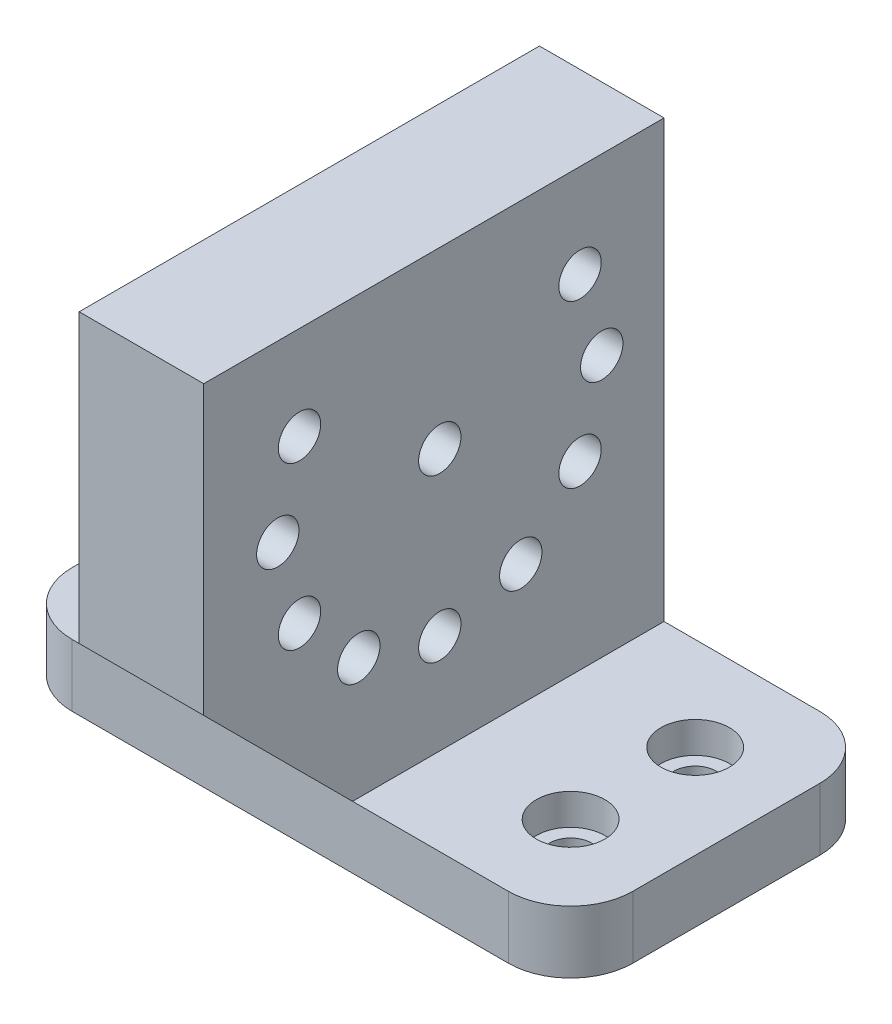
ISO-10303-21;
HEADER;
FILE_DESCRIPTION(('STEP AP214'),'2;1');
FILE_NAME('part.step','',(''),(''),'','','');
FILE_SCHEMA(('AUTOMOTIVE_DESIGN { 1 0 10303 214 1 1 1 1 }'));
ENDSEC;
DATA;
#1=APPLICATION_CONTEXT('core data for automotive mechanical design processes');
#2=APPLICATION_PROTOCOL_DEFINITION('international standard','automotive_design',2000,#1);
#3=PRODUCT_CONTEXT('',#1,'mechanical');
#4=PRODUCT('Part','Part','',(#3));
#5=PRODUCT_RELATED_PRODUCT_CATEGORY('part','',(#4));
#6=PRODUCT_DEFINITION_FORMATION('','',#4);
#7=PRODUCT_DEFINITION_CONTEXT('part definition',#1,'design');
#8=PRODUCT_DEFINITION('design','',#6,#7);
#9=PRODUCT_DEFINITION_SHAPE('','',#8);
#10=(LENGTH_UNIT() NAMED_UNIT(*) SI_UNIT(.MILLI.,.METRE.));
#11=(NAMED_UNIT(*) PLANE_ANGLE_UNIT() SI_UNIT($,.RADIAN.));
#12=(NAMED_UNIT(*) SI_UNIT($,.STERADIAN.) SOLID_ANGLE_UNIT());
#13=UNCERTAINTY_MEASURE_WITH_UNIT(LENGTH_MEASURE(1.E-05),#10,'distance_accuracy_value','');
#14=(GEOMETRIC_REPRESENTATION_CONTEXT(3) GLOBAL_UNCERTAINTY_ASSIGNED_CONTEXT((#13)) GLOBAL_UNIT_ASSIGNED_CONTEXT((#10,
#11,#12)) REPRESENTATION_CONTEXT('',''));
#15=CARTESIAN_POINT('',(0.,0.,0.));
#16=DIRECTION('',(0.,0.,1.));
#17=DIRECTION('',(1.,0.,0.));
#18=AXIS2_PLACEMENT_3D('',#15,#16,#17);
#19=CARTESIAN_POINT('',(-15.,5.,-5.));
#20=DIRECTION('',(0.,-1.,0.));
#21=DIRECTION('',(0.,0.,-1.));
#22=AXIS2_PLACEMENT_3D('',#19,#20,#21);
#23=CYLINDRICAL_SURFACE('',#22,1.7);
#24=CARTESIAN_POINT('',(-15.,0.,-5.));
#25=DIRECTION('',(0.,1.,0.));
#26=DIRECTION('',(0.,0.,1.));
#27=AXIS2_PLACEMENT_3D('',#24,#25,#26);
#28=CIRCLE('',#27,1.7);
#29=CARTESIAN_POINT('',(-15.,0.,-3.3));
#30=VERTEX_POINT('',#29);
#31=EDGE_CURVE('E175',#30,#30,#28,.T.);
#32=ORIENTED_EDGE('',*,*,#31,.F.);
#33=EDGE_LOOP('',(#32));
#34=FACE_BOUND('',#33,.T.);
#35=CARTESIAN_POINT('',(-15.,2.5,-5.));
#36=DIRECTION('',(0.,1.,0.));
#37=DIRECTION('',(0.,0.,1.));
#38=AXIS2_PLACEMENT_3D('',#35,#36,#37);
#39=CIRCLE('',#38,1.7);
#40=CARTESIAN_POINT('',(-15.,2.5,-3.3));
#41=VERTEX_POINT('',#40);
#42=EDGE_CURVE('E51',#41,#41,#39,.T.);
#43=ORIENTED_EDGE('',*,*,#42,.T.);
#44=EDGE_LOOP('',(#43));
#45=FACE_BOUND('',#44,.T.);
#46=ADVANCED_FACE('F47',(#34,#45),#23,.F.);
#47=CARTESIAN_POINT('',(15.,5.,-5.));
#48=DIRECTION('',(0.,-1.,0.));
#49=DIRECTION('',(0.,0.,-1.));
#50=AXIS2_PLACEMENT_3D('',#47,#48,#49);
#51=CYLINDRICAL_SURFACE('',#50,1.7);
#52=CARTESIAN_POINT('',(15.,0.,-5.));
#53=DIRECTION('',(0.,1.,0.));
#54=DIRECTION('',(0.,0.,-1.));
#55=AXIS2_PLACEMENT_3D('',#52,#53,#54);
#56=CIRCLE('',#55,1.7);
#57=CARTESIAN_POINT('',(15.,0.,-6.7));
#58=VERTEX_POINT('',#57);
#59=EDGE_CURVE('E320',#58,#58,#56,.T.);
#60=ORIENTED_EDGE('',*,*,#59,.F.);
#61=EDGE_LOOP('',(#60));
#62=FACE_BOUND('',#61,.T.);
#63=CARTESIAN_POINT('',(15.,2.5,-5.));
#64=DIRECTION('',(0.,1.,0.));
#65=DIRECTION('',(0.,0.,1.));
#66=AXIS2_PLACEMENT_3D('',#63,#64,#65);
#67=CIRCLE('',#66,1.7);
#68=CARTESIAN_POINT('',(15.,2.5,-3.3));
#69=VERTEX_POINT('',#68);
#70=EDGE_CURVE('E220',#69,#69,#67,.T.);
#71=ORIENTED_EDGE('',*,*,#70,.T.);
#72=EDGE_LOOP('',(#71));
#73=FACE_BOUND('',#72,.T.);
#74=ADVANCED_FACE('F447',(#62,#73),#51,.F.);
#75=CARTESIAN_POINT('',(15.,5.,5.));
#76=DIRECTION('',(0.,-1.,0.));
#77=DIRECTION('',(0.,0.,-1.));
#78=AXIS2_PLACEMENT_3D('',#75,#76,#77);
#79=CYLINDRICAL_SURFACE('',#78,1.7);
#80=CARTESIAN_POINT('',(15.,0.,5.));
#81=DIRECTION('',(0.,1.,0.));
#82=DIRECTION('',(0.,0.,1.));
#83=AXIS2_PLACEMENT_3D('',#80,#81,#82);
#84=CIRCLE('',#83,1.7);
#85=CARTESIAN_POINT('',(15.,0.,6.7));
#86=VERTEX_POINT('',#85);
#87=EDGE_CURVE('E316',#86,#86,#84,.T.);
#88=ORIENTED_EDGE('',*,*,#87,.F.);
#89=EDGE_LOOP('',(#88));
#90=FACE_BOUND('',#89,.T.);
#91=CARTESIAN_POINT('',(15.,2.5,5.));
#92=DIRECTION('',(0.,1.,0.));
#93=DIRECTION('',(0.,0.,1.));
#94=AXIS2_PLACEMENT_3D('',#91,#92,#93);
#95=CIRCLE('',#94,1.7);
#96=CARTESIAN_POINT('',(15.,2.5,6.7));
#97=VERTEX_POINT('',#96);
#98=EDGE_CURVE('E216',#97,#97,#95,.T.);
#99=ORIENTED_EDGE('',*,*,#98,.T.);
#100=EDGE_LOOP('',(#99));
#101=FACE_BOUND('',#100,.T.);
#102=ADVANCED_FACE('F453',(#90,#101),#79,.F.);
#103=CARTESIAN_POINT('',(-15.,5.,5.));
#104=DIRECTION('',(0.,-1.,0.));
#105=DIRECTION('',(0.,0.,-1.));
#106=AXIS2_PLACEMENT_3D('',#103,#104,#105);
#107=CYLINDRICAL_SURFACE('',#106,1.7);
#108=CARTESIAN_POINT('',(-15.,0.,5.));
#109=DIRECTION('',(0.,1.,0.));
#110=DIRECTION('',(0.,0.,-1.));
#111=AXIS2_PLACEMENT_3D('',#108,#109,#110);
#112=CIRCLE('',#111,1.7);
#113=CARTESIAN_POINT('',(-15.,0.,3.30000000000001));
#114=VERTEX_POINT('',#113);
#115=EDGE_CURVE('E312',#114,#114,#112,.T.);
#116=ORIENTED_EDGE('',*,*,#115,.F.);
#117=EDGE_LOOP('',(#116));
#118=FACE_BOUND('',#117,.T.);
#119=CARTESIAN_POINT('',(-15.,2.5,5.));
#120=DIRECTION('',(0.,1.,0.));
#121=DIRECTION('',(0.,0.,1.));
#122=AXIS2_PLACEMENT_3D('',#119,#120,#121);
#123=CIRCLE('',#122,1.7);
#124=CARTESIAN_POINT('',(-15.,2.5,6.7));
#125=VERTEX_POINT('',#124);
#126=EDGE_CURVE('E212',#125,#125,#123,.T.);
#127=ORIENTED_EDGE('',*,*,#126,.T.);
#128=EDGE_LOOP('',(#127));
#129=FACE_BOUND('',#128,.T.);
#130=ADVANCED_FACE('F442',(#118,#129),#107,.F.);
#131=CARTESIAN_POINT('',(17.5,5.,7.5));
#132=DIRECTION('',(0.,1.,0.));
#133=DIRECTION('',(0.,0.,1.));
#134=AXIS2_PLACEMENT_3D('',#131,#132,#133);
#135=PLANE('',#134);
#136=CARTESIAN_POINT('',(14.9999999999999,5.,-5.));
#137=DIRECTION('',(0.,1.,0.));
#138=DIRECTION('',(0.,0.,1.));
#139=AXIS2_PLACEMENT_3D('',#136,#137,#138);
#140=CIRCLE('',#139,2.75);
#141=CARTESIAN_POINT('',(14.9999999999999,5.,-2.25));
#142=VERTEX_POINT('',#141);
#143=EDGE_CURVE('E408',#142,#142,#140,.T.);
#144=ORIENTED_EDGE('',*,*,#143,.F.);
#145=EDGE_LOOP('',(#144));
#146=FACE_BOUND('',#145,.T.);
#147=CARTESIAN_POINT('',(15.,5.,5.));
#148=DIRECTION('',(0.,1.,0.));
#149=DIRECTION('',(0.,0.,1.));
#150=AXIS2_PLACEMENT_3D('',#147,#148,#149);
#151=CIRCLE('',#150,2.75);
#152=CARTESIAN_POINT('',(15.,5.,7.75));
#153=VERTEX_POINT('',#152);
#154=EDGE_CURVE('E396',#153,#153,#151,.T.);
#155=ORIENTED_EDGE('',*,*,#154,.F.);
#156=EDGE_LOOP('',(#155));
#157=FACE_BOUND('',#156,.T.);
#158=DIRECTION('',(-1.,0.,0.));
#159=VECTOR('',#158,1.);
#160=CARTESIAN_POINT('',(-17.5,5.,-12.5));
#161=LINE('',#160,#159);
#162=CARTESIAN_POINT('',(17.5,5.,-12.5));
#163=VERTEX_POINT('',#162);
#164=CARTESIAN_POINT('',(5.,5.,-12.5));
#165=VERTEX_POINT('',#164);
#166=EDGE_CURVE('E335',#163,#165,#161,.T.);
#167=ORIENTED_EDGE('',*,*,#166,.T.);
#168=DIRECTION('',(0.,0.,1.));
#169=VECTOR('',#168,1.);
#170=CARTESIAN_POINT('',(5.,5.,0.));
#171=LINE('',#170,#169);
#172=CARTESIAN_POINT('',(5.,5.,12.5));
#173=VERTEX_POINT('',#172);
#174=EDGE_CURVE('E343',#165,#173,#171,.T.);
#175=ORIENTED_EDGE('',*,*,#174,.T.);
#176=DIRECTION('',(1.,0.,0.));
#177=VECTOR('',#176,1.);
#178=CARTESIAN_POINT('',(-17.5,5.,12.5));
#179=LINE('',#178,#177);
#180=CARTESIAN_POINT('',(17.5,5.,12.5));
#181=VERTEX_POINT('',#180);
#182=EDGE_CURVE('E74',#173,#181,#179,.T.);
#183=ORIENTED_EDGE('',*,*,#182,.T.);
#184=CARTESIAN_POINT('',(17.5,5.,7.5));
#185=DIRECTION('',(0.,1.,0.));
#186=DIRECTION('',(0.,0.,1.));
#187=AXIS2_PLACEMENT_3D('',#184,#185,#186);
#188=CIRCLE('',#187,5.);
#189=CARTESIAN_POINT('',(22.5,5.,7.49999999999997));
#190=VERTEX_POINT('',#189);
#191=EDGE_CURVE('E194',#181,#190,#188,.T.);
#192=ORIENTED_EDGE('',*,*,#191,.T.);
#193=DIRECTION('',(0.,0.,-1.));
#194=VECTOR('',#193,1.);
#195=CARTESIAN_POINT('',(22.5,5.,7.49999999999997));
#196=LINE('',#195,#194);
#197=CARTESIAN_POINT('',(22.5,5.,-7.49999999999996));
#198=VERTEX_POINT('',#197);
#199=EDGE_CURVE('E116',#190,#198,#196,.T.);
#200=ORIENTED_EDGE('',*,*,#199,.T.);
#201=CARTESIAN_POINT('',(17.5,5.,-7.5));
#202=DIRECTION('',(0.,1.,0.));
#203=DIRECTION('',(0.,0.,-1.));
#204=AXIS2_PLACEMENT_3D('',#201,#202,#203);
#205=CIRCLE('',#204,5.);
#206=EDGE_CURVE('E331',#198,#163,#205,.T.);
#207=ORIENTED_EDGE('',*,*,#206,.T.);
#208=EDGE_LOOP('',(#167,#175,#183,#192,#200,#207));
#209=FACE_BOUND('',#208,.T.);
#210=ADVANCED_FACE('F432',(#146,#157,#209),#135,.T.);
#211=CARTESIAN_POINT('',(-15.0000000000001,5.,-4.99999999999979));
#212=DIRECTION('',(0.,1.,0.));
#213=DIRECTION('',(0.,0.,1.));
#214=AXIS2_PLACEMENT_3D('',#211,#212,#213);
#215=CIRCLE('',#214,2.75);
#216=CARTESIAN_POINT('',(-15.0000000000001,5.,-2.24999999999979));
#217=VERTEX_POINT('',#216);
#218=EDGE_CURVE('E416',#217,#217,#215,.T.);
#219=ORIENTED_EDGE('',*,*,#218,.F.);
#220=EDGE_LOOP('',(#219));
#221=FACE_BOUND('',#220,.T.);
#222=CARTESIAN_POINT('',(-15.,5.,5.00000000000021));
#223=DIRECTION('',(0.,1.,0.));
#224=DIRECTION('',(0.,0.,1.));
#225=AXIS2_PLACEMENT_3D('',#222,#223,#224);
#226=CIRCLE('',#225,2.75);
#227=CARTESIAN_POINT('',(-15.,5.,7.75000000000021));
#228=VERTEX_POINT('',#227);
#229=EDGE_CURVE('E400',#228,#228,#226,.T.);
#230=ORIENTED_EDGE('',*,*,#229,.F.);
#231=EDGE_LOOP('',(#230));
#232=FACE_BOUND('',#231,.T.);
#233=DIRECTION('',(0.,0.,1.));
#234=VECTOR('',#233,1.);
#235=CARTESIAN_POINT('',(-5.,5.,0.));
#236=LINE('',#235,#234);
#237=CARTESIAN_POINT('',(-5.,5.,-12.5));
#238=VERTEX_POINT('',#237);
#239=CARTESIAN_POINT('',(-5.,5.,12.5));
#240=VERTEX_POINT('',#239);
#241=EDGE_CURVE('E287',#238,#240,#236,.T.);
#242=ORIENTED_EDGE('',*,*,#241,.F.);
#243=CARTESIAN_POINT('',(-17.5,5.,-12.5));
#244=VERTEX_POINT('',#243);
#245=EDGE_CURVE('E334',#238,#244,#161,.T.);
#246=ORIENTED_EDGE('',*,*,#245,.T.);
#247=CARTESIAN_POINT('',(-17.5,5.,-7.5));
#248=DIRECTION('',(0.,1.,0.));
#249=DIRECTION('',(0.,0.,-1.));
#250=AXIS2_PLACEMENT_3D('',#247,#248,#249);
#251=CIRCLE('',#250,5.);
#252=CARTESIAN_POINT('',(-22.5,5.,-7.49999999999996));
#253=VERTEX_POINT('',#252);
#254=EDGE_CURVE('E142',#244,#253,#251,.T.);
#255=ORIENTED_EDGE('',*,*,#254,.T.);
#256=DIRECTION('',(0.,0.,1.));
#257=VECTOR('',#256,1.);
#258=CARTESIAN_POINT('',(-22.5,5.,7.49999999999997));
#259=LINE('',#258,#257);
#260=CARTESIAN_POINT('',(-22.5,5.,7.49999999999997));
#261=VERTEX_POINT('',#260);
#262=EDGE_CURVE('E133',#253,#261,#259,.T.);
#263=ORIENTED_EDGE('',*,*,#262,.T.);
#264=CARTESIAN_POINT('',(-17.5,5.,7.5));
#265=DIRECTION('',(0.,1.,0.));
#266=DIRECTION('',(0.,0.,-1.));
#267=AXIS2_PLACEMENT_3D('',#264,#265,#266);
#268=CIRCLE('',#267,5.);
#269=CARTESIAN_POINT('',(-17.5,5.,12.5));
#270=VERTEX_POINT('',#269);
#271=EDGE_CURVE('E139',#261,#270,#268,.T.);
#272=ORIENTED_EDGE('',*,*,#271,.T.);
#273=EDGE_CURVE('E164',#270,#240,#179,.T.);
#274=ORIENTED_EDGE('',*,*,#273,.T.);
#275=EDGE_LOOP('',(#242,#246,#255,#263,#272,#274));
#276=FACE_BOUND('',#275,.T.);
#277=ADVANCED_FACE('F136',(#221,#232,#276),#135,.T.);
#278=CARTESIAN_POINT('',(17.5,0.,7.5));
#279=DIRECTION('',(0.,1.,0.));
#280=DIRECTION('',(0.,0.,1.));
#281=AXIS2_PLACEMENT_3D('',#278,#279,#280);
#282=PLANE('',#281);
#283=CARTESIAN_POINT('',(17.5,0.,7.5));
#284=DIRECTION('',(0.,1.,0.));
#285=DIRECTION('',(0.,0.,1.));
#286=AXIS2_PLACEMENT_3D('',#283,#284,#285);
#287=CIRCLE('',#286,5.);
#288=CARTESIAN_POINT('',(17.5,0.,12.5));
#289=VERTEX_POINT('',#288);
#290=CARTESIAN_POINT('',(22.5,0.,7.49999999999997));
#291=VERTEX_POINT('',#290);
#292=EDGE_CURVE('E170',#289,#291,#287,.T.);
#293=ORIENTED_EDGE('',*,*,#292,.F.);
#294=DIRECTION('',(1.,0.,0.));
#295=VECTOR('',#294,1.);
#296=CARTESIAN_POINT('',(-17.5,0.,12.5));
#297=LINE('',#296,#295);
#298=CARTESIAN_POINT('',(-17.5,0.,12.5));
#299=VERTEX_POINT('',#298);
#300=EDGE_CURVE('E108',#299,#289,#297,.T.);
#301=ORIENTED_EDGE('',*,*,#300,.F.);
#302=CARTESIAN_POINT('',(-17.5,0.,7.5));
#303=DIRECTION('',(0.,1.,0.));
#304=DIRECTION('',(0.,0.,-1.));
#305=AXIS2_PLACEMENT_3D('',#302,#303,#304);
#306=CIRCLE('',#305,5.);
#307=CARTESIAN_POINT('',(-22.5,0.,7.49999999999997));
#308=VERTEX_POINT('',#307);
#309=EDGE_CURVE('E189',#308,#299,#306,.T.);
#310=ORIENTED_EDGE('',*,*,#309,.F.);
#311=DIRECTION('',(0.,0.,1.));
#312=VECTOR('',#311,1.);
#313=CARTESIAN_POINT('',(-22.5,0.,7.49999999999997));
#314=LINE('',#313,#312);
#315=CARTESIAN_POINT('',(-22.5,0.,-7.49999999999996));
#316=VERTEX_POINT('',#315);
#317=EDGE_CURVE('E152',#316,#308,#314,.T.);
#318=ORIENTED_EDGE('',*,*,#317,.F.);
#319=CARTESIAN_POINT('',(-17.5,0.,-7.5));
#320=DIRECTION('',(0.,1.,0.));
#321=DIRECTION('',(0.,0.,-1.));
#322=AXIS2_PLACEMENT_3D('',#319,#320,#321);
#323=CIRCLE('',#322,5.);
#324=CARTESIAN_POINT('',(-17.5,0.,-12.5));
#325=VERTEX_POINT('',#324);
#326=EDGE_CURVE('E184',#325,#316,#323,.T.);
#327=ORIENTED_EDGE('',*,*,#326,.F.);
#328=DIRECTION('',(-1.,0.,0.));
#329=VECTOR('',#328,1.);
#330=CARTESIAN_POINT('',(-17.5,0.,-12.5));
#331=LINE('',#330,#329);
#332=CARTESIAN_POINT('',(17.5,0.,-12.5));
#333=VERTEX_POINT('',#332);
#334=EDGE_CURVE('E181',#333,#325,#331,.T.);
#335=ORIENTED_EDGE('',*,*,#334,.F.);
#336=CARTESIAN_POINT('',(17.5,0.,-7.5));
#337=DIRECTION('',(0.,1.,0.));
#338=DIRECTION('',(0.,0.,-1.));
#339=AXIS2_PLACEMENT_3D('',#336,#337,#338);
#340=CIRCLE('',#339,5.);
#341=CARTESIAN_POINT('',(22.5,0.,-7.49999999999996));
#342=VERTEX_POINT('',#341);
#343=EDGE_CURVE('E178',#342,#333,#340,.T.);
#344=ORIENTED_EDGE('',*,*,#343,.F.);
#345=DIRECTION('',(0.,0.,-1.));
#346=VECTOR('',#345,1.);
#347=CARTESIAN_POINT('',(22.5,0.,7.49999999999997));
#348=LINE('',#347,#346);
#349=EDGE_CURVE('E174',#291,#342,#348,.T.);
#350=ORIENTED_EDGE('',*,*,#349,.F.);
#351=EDGE_LOOP('',(#293,#301,#310,#318,#327,#335,#344,#350));
#352=FACE_BOUND('',#351,.T.);
#353=ORIENTED_EDGE('',*,*,#31,.T.);
#354=EDGE_LOOP('',(#353));
#355=FACE_BOUND('',#354,.T.);
#356=ORIENTED_EDGE('',*,*,#59,.T.);
#357=EDGE_LOOP('',(#356));
#358=FACE_BOUND('',#357,.T.);
#359=ORIENTED_EDGE('',*,*,#87,.T.);
#360=EDGE_LOOP('',(#359));
#361=FACE_BOUND('',#360,.T.);
#362=ORIENTED_EDGE('',*,*,#115,.T.);
#363=EDGE_LOOP('',(#362));
#364=FACE_BOUND('',#363,.T.);
#365=ADVANCED_FACE('F431',(#352,#355,#358,#361,#364),#282,.F.);
#366=CARTESIAN_POINT('',(17.5,5.,7.5));
#367=DIRECTION('',(0.,-1.,0.));
#368=DIRECTION('',(0.,0.,-1.));
#369=AXIS2_PLACEMENT_3D('',#366,#367,#368);
#370=CYLINDRICAL_SURFACE('',#369,5.);
#371=ORIENTED_EDGE('',*,*,#292,.T.);
#372=DIRECTION('',(0.,-1.,0.));
#373=VECTOR('',#372,1.);
#374=CARTESIAN_POINT('',(22.5,5.,7.49999999999997));
#375=LINE('',#374,#373);
#376=EDGE_CURVE('E11',#190,#291,#375,.T.);
#377=ORIENTED_EDGE('',*,*,#376,.F.);
#378=ORIENTED_EDGE('',*,*,#191,.F.);
#379=DIRECTION('',(0.,-1.,0.));
#380=VECTOR('',#379,1.);
#381=CARTESIAN_POINT('',(17.5,5.,12.5));
#382=LINE('',#381,#380);
#383=EDGE_CURVE('E169',#181,#289,#382,.T.);
#384=ORIENTED_EDGE('',*,*,#383,.T.);
#385=EDGE_LOOP('',(#371,#377,#378,#384));
#386=FACE_BOUND('',#385,.T.);
#387=ADVANCED_FACE('F49',(#386),#370,.T.);
#388=CARTESIAN_POINT('',(22.5,5.,7.49999999999997));
#389=DIRECTION('',(-1.,0.,0.));
#390=DIRECTION('',(0.,0.,1.));
#391=AXIS2_PLACEMENT_3D('',#388,#389,#390);
#392=PLANE('',#391);
#393=ORIENTED_EDGE('',*,*,#349,.T.);
#394=DIRECTION('',(0.,-1.,0.));
#395=VECTOR('',#394,1.);
#396=CARTESIAN_POINT('',(22.5,5.,-7.49999999999996));
#397=LINE('',#396,#395);
#398=EDGE_CURVE('E57',#198,#342,#397,.T.);
#399=ORIENTED_EDGE('',*,*,#398,.F.);
#400=ORIENTED_EDGE('',*,*,#199,.F.);
#401=ORIENTED_EDGE('',*,*,#376,.T.);
#402=EDGE_LOOP('',(#393,#399,#400,#401));
#403=FACE_BOUND('',#402,.T.);
#404=ADVANCED_FACE('F750',(#403),#392,.F.);
#405=CARTESIAN_POINT('',(17.5,5.,-7.5));
#406=DIRECTION('',(0.,-1.,0.));
#407=DIRECTION('',(0.,0.,-1.));
#408=AXIS2_PLACEMENT_3D('',#405,#406,#407);
#409=CYLINDRICAL_SURFACE('',#408,5.);
#410=ORIENTED_EDGE('',*,*,#343,.T.);
#411=DIRECTION('',(0.,-1.,0.));
#412=VECTOR('',#411,1.);
#413=CARTESIAN_POINT('',(17.5,5.,-12.5));
#414=LINE('',#413,#412);
#415=EDGE_CURVE('E205',#163,#333,#414,.T.);
#416=ORIENTED_EDGE('',*,*,#415,.F.);
#417=ORIENTED_EDGE('',*,*,#206,.F.);
#418=ORIENTED_EDGE('',*,*,#398,.T.);
#419=EDGE_LOOP('',(#410,#416,#417,#418));
#420=FACE_BOUND('',#419,.T.);
#421=ADVANCED_FACE('F741',(#420),#409,.T.);
#422=CARTESIAN_POINT('',(-17.5,5.,-12.5));
#423=DIRECTION('',(0.,0.,1.));
#424=DIRECTION('',(1.,0.,0.));
#425=AXIS2_PLACEMENT_3D('',#422,#423,#424);
#426=PLANE('',#425);
#427=ORIENTED_EDGE('',*,*,#334,.T.);
#428=DIRECTION('',(0.,-1.,0.));
#429=VECTOR('',#428,1.);
#430=CARTESIAN_POINT('',(-17.5,5.,-12.5));
#431=LINE('',#430,#429);
#432=EDGE_CURVE('E201',#244,#325,#431,.T.);
#433=ORIENTED_EDGE('',*,*,#432,.F.);
#434=ORIENTED_EDGE('',*,*,#245,.F.);
#435=DIRECTION('',(0.,1.,0.));
#436=VECTOR('',#435,1.);
#437=CARTESIAN_POINT('',(-5.,0.,-12.5));
#438=LINE('',#437,#436);
#439=CARTESIAN_POINT('',(-5.,40.,-12.4999999999999));
#440=VERTEX_POINT('',#439);
#441=EDGE_CURVE('E291',#238,#440,#438,.T.);
#442=ORIENTED_EDGE('',*,*,#441,.T.);
#443=DIRECTION('',(-1.,0.,0.));
#444=VECTOR('',#443,1.);
#445=CARTESIAN_POINT('',(5.,40.,-12.4999999999999));
#446=LINE('',#445,#444);
#447=CARTESIAN_POINT('',(5.,40.,-12.4999999999999));
#448=VERTEX_POINT('',#447);
#449=EDGE_CURVE('E296',#448,#440,#446,.T.);
#450=ORIENTED_EDGE('',*,*,#449,.F.);
#451=DIRECTION('',(0.,1.,0.));
#452=VECTOR('',#451,1.);
#453=CARTESIAN_POINT('',(5.,0.,-12.5));
#454=LINE('',#453,#452);
#455=EDGE_CURVE('E241',#165,#448,#454,.T.);
#456=ORIENTED_EDGE('',*,*,#455,.F.);
#457=ORIENTED_EDGE('',*,*,#166,.F.);
#458=ORIENTED_EDGE('',*,*,#415,.T.);
#459=EDGE_LOOP('',(#427,#433,#434,#442,#450,#456,#457,#458));
#460=FACE_BOUND('',#459,.T.);
#461=ADVANCED_FACE('F732',(#460),#426,.F.);
#462=CARTESIAN_POINT('',(-17.5,5.,-7.5));
#463=DIRECTION('',(0.,-1.,0.));
#464=DIRECTION('',(0.,0.,-1.));
#465=AXIS2_PLACEMENT_3D('',#462,#463,#464);
#466=CYLINDRICAL_SURFACE('',#465,5.);
#467=ORIENTED_EDGE('',*,*,#326,.T.);
#468=DIRECTION('',(0.,-1.,0.));
#469=VECTOR('',#468,1.);
#470=CARTESIAN_POINT('',(-22.5,5.,-7.49999999999996));
#471=LINE('',#470,#469);
#472=EDGE_CURVE('E156',#253,#316,#471,.T.);
#473=ORIENTED_EDGE('',*,*,#472,.F.);
#474=ORIENTED_EDGE('',*,*,#254,.F.);
#475=ORIENTED_EDGE('',*,*,#432,.T.);
#476=EDGE_LOOP('',(#467,#473,#474,#475));
#477=FACE_BOUND('',#476,.T.);
#478=ADVANCED_FACE('F724',(#477),#466,.T.);
#479=CARTESIAN_POINT('',(-22.5,5.,7.49999999999997));
#480=DIRECTION('',(1.,0.,0.));
#481=DIRECTION('',(0.,0.,-1.));
#482=AXIS2_PLACEMENT_3D('',#479,#480,#481);
#483=PLANE('',#482);
#484=ORIENTED_EDGE('',*,*,#317,.T.);
#485=DIRECTION('',(0.,-1.,0.));
#486=VECTOR('',#485,1.);
#487=CARTESIAN_POINT('',(-22.5,5.,7.49999999999997));
#488=LINE('',#487,#486);
#489=EDGE_CURVE('E149',#261,#308,#488,.T.);
#490=ORIENTED_EDGE('',*,*,#489,.F.);
#491=ORIENTED_EDGE('',*,*,#262,.F.);
#492=ORIENTED_EDGE('',*,*,#472,.T.);
#493=EDGE_LOOP('',(#484,#490,#491,#492));
#494=FACE_BOUND('',#493,.T.);
#495=ADVANCED_FACE('F150',(#494),#483,.F.);
#496=CARTESIAN_POINT('',(-17.5,5.,7.5));
#497=DIRECTION('',(0.,-1.,0.));
#498=DIRECTION('',(0.,0.,-1.));
#499=AXIS2_PLACEMENT_3D('',#496,#497,#498);
#500=CYLINDRICAL_SURFACE('',#499,5.);
#501=ORIENTED_EDGE('',*,*,#309,.T.);
#502=DIRECTION('',(0.,-1.,0.));
#503=VECTOR('',#502,1.);
#504=CARTESIAN_POINT('',(-17.5,5.,12.5));
#505=LINE('',#504,#503);
#506=EDGE_CURVE('E157',#270,#299,#505,.T.);
#507=ORIENTED_EDGE('',*,*,#506,.F.);
#508=ORIENTED_EDGE('',*,*,#271,.F.);
#509=ORIENTED_EDGE('',*,*,#489,.T.);
#510=EDGE_LOOP('',(#501,#507,#508,#509));
#511=FACE_BOUND('',#510,.T.);
#512=ADVANCED_FACE('F159',(#511),#500,.T.);
#513=CARTESIAN_POINT('',(-17.5,5.,12.5));
#514=DIRECTION('',(0.,0.,-1.));
#515=DIRECTION('',(-1.,0.,0.));
#516=AXIS2_PLACEMENT_3D('',#513,#514,#515);
#517=PLANE('',#516);
#518=ORIENTED_EDGE('',*,*,#300,.T.);
#519=ORIENTED_EDGE('',*,*,#383,.F.);
#520=ORIENTED_EDGE('',*,*,#182,.F.);
#521=DIRECTION('',(-1.,0.,0.));
#522=VECTOR('',#521,1.);
#523=CARTESIAN_POINT('',(5.,5.,12.5));
#524=LINE('',#523,#522);
#525=EDGE_CURVE('E300',#173,#240,#524,.T.);
#526=ORIENTED_EDGE('',*,*,#525,.T.);
#527=ORIENTED_EDGE('',*,*,#273,.F.);
#528=ORIENTED_EDGE('',*,*,#506,.T.);
#529=EDGE_LOOP('',(#518,#519,#520,#526,#527,#528));
#530=FACE_BOUND('',#529,.T.);
#531=ADVANCED_FACE('F509',(#530),#517,.F.);
#532=CARTESIAN_POINT('',(5.,40.,0.));
#533=DIRECTION('',(0.,1.,0.));
#534=DIRECTION('',(0.,0.,1.));
#535=AXIS2_PLACEMENT_3D('',#532,#533,#534);
#536=PLANE('',#535);
#537=DIRECTION('',(0.,0.,-1.));
#538=VECTOR('',#537,1.);
#539=CARTESIAN_POINT('',(-5.,40.,0.));
#540=LINE('',#539,#538);
#541=CARTESIAN_POINT('',(-5.,40.,24.4429066986981));
#542=VERTEX_POINT('',#541);
#543=EDGE_CURVE('E275',#542,#440,#540,.T.);
#544=ORIENTED_EDGE('',*,*,#543,.F.);
#545=DIRECTION('',(-1.,0.,0.));
#546=VECTOR('',#545,1.);
#547=CARTESIAN_POINT('',(5.,40.,24.4429066986981));
#548=LINE('',#547,#546);
#549=CARTESIAN_POINT('',(5.,40.,24.4429066986981));
#550=VERTEX_POINT('',#549);
#551=EDGE_CURVE('E308',#550,#542,#548,.T.);
#552=ORIENTED_EDGE('',*,*,#551,.F.);
#553=DIRECTION('',(0.,0.,-1.));
#554=VECTOR('',#553,1.);
#555=CARTESIAN_POINT('',(5.,40.,0.));
#556=LINE('',#555,#554);
#557=EDGE_CURVE('E350',#550,#448,#556,.T.);
#558=ORIENTED_EDGE('',*,*,#557,.T.);
#559=ORIENTED_EDGE('',*,*,#449,.T.);
#560=EDGE_LOOP('',(#544,#552,#558,#559));
#561=FACE_BOUND('',#560,.T.);
#562=ADVANCED_FACE('F505',(#561),#536,.T.);
#563=CARTESIAN_POINT('',(5.,0.,24.4429066986981));
#564=DIRECTION('',(0.,0.,1.));
#565=DIRECTION('',(1.,0.,0.));
#566=AXIS2_PLACEMENT_3D('',#563,#564,#565);
#567=PLANE('',#566);
#568=DIRECTION('',(0.,1.,0.));
#569=VECTOR('',#568,1.);
#570=CARTESIAN_POINT('',(-5.,0.,24.4429066986981));
#571=LINE('',#570,#569);
#572=CARTESIAN_POINT('',(-5.,16.9429066986981,24.4429066986981));
#573=VERTEX_POINT('',#572);
#574=EDGE_CURVE('E279',#573,#542,#571,.T.);
#575=ORIENTED_EDGE('',*,*,#574,.F.);
#576=DIRECTION('',(-1.,0.,0.));
#577=VECTOR('',#576,1.);
#578=CARTESIAN_POINT('',(5.,16.9429066986981,24.4429066986981));
#579=LINE('',#578,#577);
#580=CARTESIAN_POINT('',(5.,16.9429066986981,24.4429066986981));
#581=VERTEX_POINT('',#580);
#582=EDGE_CURVE('E304',#581,#573,#579,.T.);
#583=ORIENTED_EDGE('',*,*,#582,.F.);
#584=DIRECTION('',(0.,1.,0.));
#585=VECTOR('',#584,1.);
#586=CARTESIAN_POINT('',(5.,0.,24.4429066986981));
#587=LINE('',#586,#585);
#588=EDGE_CURVE('E346',#581,#550,#587,.T.);
#589=ORIENTED_EDGE('',*,*,#588,.T.);
#590=ORIENTED_EDGE('',*,*,#551,.T.);
#591=EDGE_LOOP('',(#575,#583,#589,#590));
#592=FACE_BOUND('',#591,.T.);
#593=ADVANCED_FACE('F508',(#592),#567,.T.);
#594=CARTESIAN_POINT('',(5.,-3.75000000000001,3.75000000000002));
#595=DIRECTION('',(0.,-0.707106781186546,0.707106781186549));
#596=DIRECTION('',(0.,-0.707106781186549,-0.707106781186546));
#597=AXIS2_PLACEMENT_3D('',#594,#595,#596);
#598=PLANE('',#597);
#599=DIRECTION('',(0.,0.707106781186549,0.707106781186546));
#600=VECTOR('',#599,1.);
#601=CARTESIAN_POINT('',(-5.,-3.75000000000001,3.75000000000002));
#602=LINE('',#601,#600);
#603=EDGE_CURVE('E283',#240,#573,#602,.T.);
#604=ORIENTED_EDGE('',*,*,#603,.F.);
#605=ORIENTED_EDGE('',*,*,#525,.F.);
#606=DIRECTION('',(0.,0.707106781186549,0.707106781186546));
#607=VECTOR('',#606,1.);
#608=CARTESIAN_POINT('',(5.,-3.75000000000001,3.75000000000002));
#609=LINE('',#608,#607);
#610=EDGE_CURVE('E65',#173,#581,#609,.T.);
#611=ORIENTED_EDGE('',*,*,#610,.T.);
#612=ORIENTED_EDGE('',*,*,#582,.T.);
#613=EDGE_LOOP('',(#604,#605,#611,#612));
#614=FACE_BOUND('',#613,.T.);
#615=ADVANCED_FACE('F503',(#614),#598,.T.);
#616=CARTESIAN_POINT('',(5.,26.,5.50000000000008));
#617=DIRECTION('',(-1.,0.,0.));
#618=DIRECTION('',(0.,0.,1.));
#619=AXIS2_PLACEMENT_3D('',#616,#617,#618);
#620=CYLINDRICAL_SURFACE('',#619,1.7);
#621=CARTESIAN_POINT('',(5.,26.,5.50000000000008));
#622=DIRECTION('',(1.,0.,0.));
#623=DIRECTION('',(0.,0.,-1.));
#624=AXIS2_PLACEMENT_3D('',#621,#622,#623);
#625=CIRCLE('',#624,1.7);
#626=CARTESIAN_POINT('',(5.,26.,3.80000000000008));
#627=VERTEX_POINT('',#626);
#628=EDGE_CURVE('E354',#627,#627,#625,.T.);
#629=ORIENTED_EDGE('',*,*,#628,.T.);
#630=EDGE_LOOP('',(#629));
#631=FACE_BOUND('',#630,.T.);
#632=CARTESIAN_POINT('',(-5.,26.,5.50000000000008));
#633=DIRECTION('',(1.,0.,0.));
#634=DIRECTION('',(0.,0.,-1.));
#635=AXIS2_PLACEMENT_3D('',#632,#633,#634);
#636=CIRCLE('',#635,1.7);
#637=CARTESIAN_POINT('',(-5.,26.,3.80000000000008));
#638=VERTEX_POINT('',#637);
#639=EDGE_CURVE('E271',#638,#638,#636,.T.);
#640=ORIENTED_EDGE('',*,*,#639,.F.);
#641=EDGE_LOOP('',(#640));
#642=FACE_BOUND('',#641,.T.);
#643=ADVANCED_FACE('F499',(#631,#642),#620,.F.);
#644=CARTESIAN_POINT('',(5.,13.,5.50000000000009));
#645=DIRECTION('',(-1.,0.,0.));
#646=DIRECTION('',(0.,0.,1.));
#647=AXIS2_PLACEMENT_3D('',#644,#645,#646);
#648=CYLINDRICAL_SURFACE('',#647,1.7);
#649=CARTESIAN_POINT('',(5.,13.,5.50000000000009));
#650=DIRECTION('',(1.,0.,0.));
#651=DIRECTION('',(0.,0.,-1.));
#652=AXIS2_PLACEMENT_3D('',#649,#650,#651);
#653=CIRCLE('',#652,1.7);
#654=CARTESIAN_POINT('',(5.,13.,3.80000000000009));
#655=VERTEX_POINT('',#654);
#656=EDGE_CURVE('E358',#655,#655,#653,.T.);
#657=ORIENTED_EDGE('',*,*,#656,.T.);
#658=EDGE_LOOP('',(#657));
#659=FACE_BOUND('',#658,.T.);
#660=CARTESIAN_POINT('',(-5.,13.,5.50000000000009));
#661=DIRECTION('',(1.,0.,0.));
#662=DIRECTION('',(0.,0.,-1.));
#663=AXIS2_PLACEMENT_3D('',#660,#661,#662);
#664=CIRCLE('',#663,1.7);
#665=CARTESIAN_POINT('',(-5.,13.,3.80000000000009));
#666=VERTEX_POINT('',#665);
#667=EDGE_CURVE('E267',#666,#666,#664,.T.);
#668=ORIENTED_EDGE('',*,*,#667,.F.);
#669=EDGE_LOOP('',(#668));
#670=FACE_BOUND('',#669,.T.);
#671=ADVANCED_FACE('F495',(#659,#670),#648,.F.);
#672=CARTESIAN_POINT('',(5.,14.7416697508023,12.0000000000001));
#673=DIRECTION('',(-1.,0.,0.));
#674=DIRECTION('',(0.,0.,1.));
#675=AXIS2_PLACEMENT_3D('',#672,#673,#674);
#676=CYLINDRICAL_SURFACE('',#675,1.7);
#677=CARTESIAN_POINT('',(5.,14.7416697508023,12.0000000000001));
#678=DIRECTION('',(1.,0.,0.));
#679=DIRECTION('',(0.,0.,-1.));
#680=AXIS2_PLACEMENT_3D('',#677,#678,#679);
#681=CIRCLE('',#680,1.7);
#682=CARTESIAN_POINT('',(5.,14.7416697508023,10.3000000000001));
#683=VERTEX_POINT('',#682);
#684=EDGE_CURVE('E362',#683,#683,#681,.T.);
#685=ORIENTED_EDGE('',*,*,#684,.T.);
#686=EDGE_LOOP('',(#685));
#687=FACE_BOUND('',#686,.T.);
#688=CARTESIAN_POINT('',(-5.,14.7416697508023,12.0000000000001));
#689=DIRECTION('',(1.,0.,0.));
#690=DIRECTION('',(0.,0.,-1.));
#691=AXIS2_PLACEMENT_3D('',#688,#689,#690);
#692=CIRCLE('',#691,1.7);
#693=CARTESIAN_POINT('',(-5.,14.7416697508023,10.3000000000001));
#694=VERTEX_POINT('',#693);
#695=EDGE_CURVE('E263',#694,#694,#692,.T.);
#696=ORIENTED_EDGE('',*,*,#695,.F.);
#697=EDGE_LOOP('',(#696));
#698=FACE_BOUND('',#697,.T.);
#699=ADVANCED_FACE('F491',(#687,#698),#676,.F.);
#700=CARTESIAN_POINT('',(5.,19.5,16.7583302491978));
#701=DIRECTION('',(-1.,0.,0.));
#702=DIRECTION('',(0.,0.,1.));
#703=AXIS2_PLACEMENT_3D('',#700,#701,#702);
#704=CYLINDRICAL_SURFACE('',#703,1.7);
#705=CARTESIAN_POINT('',(5.,19.5,16.7583302491978));
#706=DIRECTION('',(1.,0.,0.));
#707=DIRECTION('',(0.,0.,-1.));
#708=AXIS2_PLACEMENT_3D('',#705,#706,#707);
#709=CIRCLE('',#708,1.7);
#710=CARTESIAN_POINT('',(5.,19.5,15.0583302491978));
#711=VERTEX_POINT('',#710);
#712=EDGE_CURVE('E366',#711,#711,#709,.T.);
#713=ORIENTED_EDGE('',*,*,#712,.T.);
#714=EDGE_LOOP('',(#713));
#715=FACE_BOUND('',#714,.T.);
#716=CARTESIAN_POINT('',(-5.,19.5,16.7583302491978));
#717=DIRECTION('',(1.,0.,0.));
#718=DIRECTION('',(0.,0.,-1.));
#719=AXIS2_PLACEMENT_3D('',#716,#717,#718);
#720=CIRCLE('',#719,1.7);
#721=CARTESIAN_POINT('',(-5.,19.5,15.0583302491978));
#722=VERTEX_POINT('',#721);
#723=EDGE_CURVE('E259',#722,#722,#720,.T.);
#724=ORIENTED_EDGE('',*,*,#723,.F.);
#725=EDGE_LOOP('',(#724));
#726=FACE_BOUND('',#725,.T.);
#727=ADVANCED_FACE('F487',(#715,#726),#704,.F.);
#728=CARTESIAN_POINT('',(5.,26.,18.5000000000001));
#729=DIRECTION('',(-1.,0.,0.));
#730=DIRECTION('',(0.,0.,1.));
#731=AXIS2_PLACEMENT_3D('',#728,#729,#730);
#732=CYLINDRICAL_SURFACE('',#731,1.7);
#733=CARTESIAN_POINT('',(5.,26.,18.5000000000001));
#734=DIRECTION('',(1.,0.,0.));
#735=DIRECTION('',(0.,0.,-1.));
#736=AXIS2_PLACEMENT_3D('',#733,#734,#735);
#737=CIRCLE('',#736,1.7);
#738=CARTESIAN_POINT('',(5.,26.,16.8000000000001));
#739=VERTEX_POINT('',#738);
#740=EDGE_CURVE('E370',#739,#739,#737,.T.);
#741=ORIENTED_EDGE('',*,*,#740,.T.);
#742=EDGE_LOOP('',(#741));
#743=FACE_BOUND('',#742,.T.);
#744=CARTESIAN_POINT('',(-5.,26.,18.5000000000001));
#745=DIRECTION('',(1.,0.,0.));
#746=DIRECTION('',(0.,0.,-1.));
#747=AXIS2_PLACEMENT_3D('',#744,#745,#746);
#748=CIRCLE('',#747,1.7);
#749=CARTESIAN_POINT('',(-5.,26.,16.8000000000001));
#750=VERTEX_POINT('',#749);
#751=EDGE_CURVE('E255',#750,#750,#748,.T.);
#752=ORIENTED_EDGE('',*,*,#751,.F.);
#753=EDGE_LOOP('',(#752));
#754=FACE_BOUND('',#753,.T.);
#755=ADVANCED_FACE('F483',(#743,#754),#732,.F.);
#756=CARTESIAN_POINT('',(5.,32.5,16.7583302491978));
#757=DIRECTION('',(-1.,0.,0.));
#758=DIRECTION('',(0.,0.,1.));
#759=AXIS2_PLACEMENT_3D('',#756,#757,#758);
#760=CYLINDRICAL_SURFACE('',#759,1.7);
#761=CARTESIAN_POINT('',(5.,32.5,16.7583302491978));
#762=DIRECTION('',(1.,0.,0.));
#763=DIRECTION('',(0.,0.,-1.));
#764=AXIS2_PLACEMENT_3D('',#761,#762,#763);
#765=CIRCLE('',#764,1.7);
#766=CARTESIAN_POINT('',(5.,32.5,15.0583302491978));
#767=VERTEX_POINT('',#766);
#768=EDGE_CURVE('E374',#767,#767,#765,.T.);
#769=ORIENTED_EDGE('',*,*,#768,.T.);
#770=EDGE_LOOP('',(#769));
#771=FACE_BOUND('',#770,.T.);
#772=CARTESIAN_POINT('',(-5.,32.5,16.7583302491978));
#773=DIRECTION('',(1.,0.,0.));
#774=DIRECTION('',(0.,0.,-1.));
#775=AXIS2_PLACEMENT_3D('',#772,#773,#774);
#776=CIRCLE('',#775,1.7);
#777=CARTESIAN_POINT('',(-5.,32.5,15.0583302491978));
#778=VERTEX_POINT('',#777);
#779=EDGE_CURVE('E251',#778,#778,#776,.T.);
#780=ORIENTED_EDGE('',*,*,#779,.F.);
#781=EDGE_LOOP('',(#780));
#782=FACE_BOUND('',#781,.T.);
#783=ADVANCED_FACE('F479',(#771,#782),#760,.F.);
#784=CARTESIAN_POINT('',(5.,32.5,-5.75833024919761));
#785=DIRECTION('',(-1.,0.,0.));
#786=DIRECTION('',(0.,0.,1.));
#787=AXIS2_PLACEMENT_3D('',#784,#785,#786);
#788=CYLINDRICAL_SURFACE('',#787,1.7);
#789=CARTESIAN_POINT('',(5.,32.5,-5.75833024919761));
#790=DIRECTION('',(1.,0.,0.));
#791=DIRECTION('',(0.,0.,-1.));
#792=AXIS2_PLACEMENT_3D('',#789,#790,#791);
#793=CIRCLE('',#792,1.7);
#794=CARTESIAN_POINT('',(5.,32.5,-7.45833024919761));
#795=VERTEX_POINT('',#794);
#796=EDGE_CURVE('E378',#795,#795,#793,.T.);
#797=ORIENTED_EDGE('',*,*,#796,.T.);
#798=EDGE_LOOP('',(#797));
#799=FACE_BOUND('',#798,.T.);
#800=CARTESIAN_POINT('',(-5.,32.5,-5.75833024919761));
#801=DIRECTION('',(1.,0.,0.));
#802=DIRECTION('',(0.,0.,-1.));
#803=AXIS2_PLACEMENT_3D('',#800,#801,#802);
#804=CIRCLE('',#803,1.7);
#805=CARTESIAN_POINT('',(-5.,32.5,-7.45833024919761));
#806=VERTEX_POINT('',#805);
#807=EDGE_CURVE('E247',#806,#806,#804,.T.);
#808=ORIENTED_EDGE('',*,*,#807,.F.);
#809=EDGE_LOOP('',(#808));
#810=FACE_BOUND('',#809,.T.);
#811=ADVANCED_FACE('F475',(#799,#810),#788,.F.);
#812=CARTESIAN_POINT('',(5.,26.,-7.49999999999991));
#813=DIRECTION('',(-1.,0.,0.));
#814=DIRECTION('',(0.,0.,1.));
#815=AXIS2_PLACEMENT_3D('',#812,#813,#814);
#816=CYLINDRICAL_SURFACE('',#815,1.7);
#817=CARTESIAN_POINT('',(5.,26.,-7.49999999999991));
#818=DIRECTION('',(1.,0.,0.));
#819=DIRECTION('',(0.,0.,-1.));
#820=AXIS2_PLACEMENT_3D('',#817,#818,#819);
#821=CIRCLE('',#820,1.7);
#822=CARTESIAN_POINT('',(5.,26.,-9.19999999999991));
#823=VERTEX_POINT('',#822);
#824=EDGE_CURVE('E382',#823,#823,#821,.T.);
#825=ORIENTED_EDGE('',*,*,#824,.T.);
#826=EDGE_LOOP('',(#825));
#827=FACE_BOUND('',#826,.T.);
#828=CARTESIAN_POINT('',(-5.,26.,-7.49999999999991));
#829=DIRECTION('',(1.,0.,0.));
#830=DIRECTION('',(0.,0.,-1.));
#831=AXIS2_PLACEMENT_3D('',#828,#829,#830);
#832=CIRCLE('',#831,1.7);
#833=CARTESIAN_POINT('',(-5.,26.,-9.19999999999991));
#834=VERTEX_POINT('',#833);
#835=EDGE_CURVE('E238',#834,#834,#832,.T.);
#836=ORIENTED_EDGE('',*,*,#835,.F.);
#837=EDGE_LOOP('',(#836));
#838=FACE_BOUND('',#837,.T.);
#839=ADVANCED_FACE('F471',(#827,#838),#816,.F.);
#840=CARTESIAN_POINT('',(5.,19.5,-5.75833024919761));
#841=DIRECTION('',(-1.,0.,0.));
#842=DIRECTION('',(0.,0.,1.));
#843=AXIS2_PLACEMENT_3D('',#840,#841,#842);
#844=CYLINDRICAL_SURFACE('',#843,1.7);
#845=CARTESIAN_POINT('',(5.,19.5,-5.75833024919761));
#846=DIRECTION('',(1.,0.,0.));
#847=DIRECTION('',(0.,0.,-1.));
#848=AXIS2_PLACEMENT_3D('',#845,#846,#847);
#849=CIRCLE('',#848,1.7);
#850=CARTESIAN_POINT('',(5.,19.5,-7.45833024919761));
#851=VERTEX_POINT('',#850);
#852=EDGE_CURVE('E386',#851,#851,#849,.T.);
#853=ORIENTED_EDGE('',*,*,#852,.T.);
#854=EDGE_LOOP('',(#853));
#855=FACE_BOUND('',#854,.T.);
#856=CARTESIAN_POINT('',(-5.,19.5,-5.75833024919761));
#857=DIRECTION('',(1.,0.,0.));
#858=DIRECTION('',(0.,0.,-1.));
#859=AXIS2_PLACEMENT_3D('',#856,#857,#858);
#860=CIRCLE('',#859,1.7);
#861=CARTESIAN_POINT('',(-5.,19.5,-7.45833024919761));
#862=VERTEX_POINT('',#861);
#863=EDGE_CURVE('E232',#862,#862,#860,.T.);
#864=ORIENTED_EDGE('',*,*,#863,.F.);
#865=EDGE_LOOP('',(#864));
#866=FACE_BOUND('',#865,.T.);
#867=ADVANCED_FACE('F468',(#855,#866),#844,.F.);
#868=CARTESIAN_POINT('',(5.,14.7416697508023,-0.999999999999913));
#869=DIRECTION('',(-1.,0.,0.));
#870=DIRECTION('',(0.,0.,1.));
#871=AXIS2_PLACEMENT_3D('',#868,#869,#870);
#872=CYLINDRICAL_SURFACE('',#871,1.7);
#873=CARTESIAN_POINT('',(5.,14.7416697508023,-0.999999999999913));
#874=DIRECTION('',(1.,0.,0.));
#875=DIRECTION('',(0.,0.,-1.));
#876=AXIS2_PLACEMENT_3D('',#873,#874,#875);
#877=CIRCLE('',#876,1.7);
#878=CARTESIAN_POINT('',(5.,14.7416697508023,-2.69999999999991));
#879=VERTEX_POINT('',#878);
#880=EDGE_CURVE('E295',#879,#879,#877,.T.);
#881=ORIENTED_EDGE('',*,*,#880,.T.);
#882=EDGE_LOOP('',(#881));
#883=FACE_BOUND('',#882,.T.);
#884=CARTESIAN_POINT('',(-5.,14.7416697508023,-0.999999999999913));
#885=DIRECTION('',(1.,0.,0.));
#886=DIRECTION('',(0.,0.,-1.));
#887=AXIS2_PLACEMENT_3D('',#884,#885,#886);
#888=CIRCLE('',#887,1.7);
#889=CARTESIAN_POINT('',(-5.,14.7416697508023,-2.69999999999991));
#890=VERTEX_POINT('',#889);
#891=EDGE_CURVE('E227',#890,#890,#888,.T.);
#892=ORIENTED_EDGE('',*,*,#891,.F.);
#893=EDGE_LOOP('',(#892));
#894=FACE_BOUND('',#893,.T.);
#895=ADVANCED_FACE('F464',(#883,#894),#872,.F.);
#896=CARTESIAN_POINT('',(5.,0.,0.));
#897=DIRECTION('',(1.,0.,0.));
#898=DIRECTION('',(0.,0.,-1.));
#899=AXIS2_PLACEMENT_3D('',#896,#897,#898);
#900=PLANE('',#899);
#901=ORIENTED_EDGE('',*,*,#880,.F.);
#902=EDGE_LOOP('',(#901));
#903=FACE_BOUND('',#902,.T.);
#904=ORIENTED_EDGE('',*,*,#852,.F.);
#905=EDGE_LOOP('',(#904));
#906=FACE_BOUND('',#905,.T.);
#907=ORIENTED_EDGE('',*,*,#824,.F.);
#908=EDGE_LOOP('',(#907));
#909=FACE_BOUND('',#908,.T.);
#910=ORIENTED_EDGE('',*,*,#796,.F.);
#911=EDGE_LOOP('',(#910));
#912=FACE_BOUND('',#911,.T.);
#913=ORIENTED_EDGE('',*,*,#768,.F.);
#914=EDGE_LOOP('',(#913));
#915=FACE_BOUND('',#914,.T.);
#916=ORIENTED_EDGE('',*,*,#740,.F.);
#917=EDGE_LOOP('',(#916));
#918=FACE_BOUND('',#917,.T.);
#919=ORIENTED_EDGE('',*,*,#712,.F.);
#920=EDGE_LOOP('',(#919));
#921=FACE_BOUND('',#920,.T.);
#922=ORIENTED_EDGE('',*,*,#684,.F.);
#923=EDGE_LOOP('',(#922));
#924=FACE_BOUND('',#923,.T.);
#925=ORIENTED_EDGE('',*,*,#656,.F.);
#926=EDGE_LOOP('',(#925));
#927=FACE_BOUND('',#926,.T.);
#928=ORIENTED_EDGE('',*,*,#628,.F.);
#929=EDGE_LOOP('',(#928));
#930=FACE_BOUND('',#929,.T.);
#931=ORIENTED_EDGE('',*,*,#557,.F.);
#932=ORIENTED_EDGE('',*,*,#588,.F.);
#933=ORIENTED_EDGE('',*,*,#610,.F.);
#934=ORIENTED_EDGE('',*,*,#174,.F.);
#935=ORIENTED_EDGE('',*,*,#455,.T.);
#936=EDGE_LOOP('',(#931,#932,#933,#934,#935));
#937=FACE_BOUND('',#936,.T.);
#938=ADVANCED_FACE('F467',(#903,#906,#909,#912,#915,#918,#921,#924,#927,#930,#937),#900,.T.);
#939=CARTESIAN_POINT('',(-5.,0.,0.));
#940=DIRECTION('',(1.,0.,0.));
#941=DIRECTION('',(0.,0.,-1.));
#942=AXIS2_PLACEMENT_3D('',#939,#940,#941);
#943=PLANE('',#942);
#944=ORIENTED_EDGE('',*,*,#891,.T.);
#945=EDGE_LOOP('',(#944));
#946=FACE_BOUND('',#945,.T.);
#947=ORIENTED_EDGE('',*,*,#863,.T.);
#948=EDGE_LOOP('',(#947));
#949=FACE_BOUND('',#948,.T.);
#950=ORIENTED_EDGE('',*,*,#835,.T.);
#951=EDGE_LOOP('',(#950));
#952=FACE_BOUND('',#951,.T.);
#953=ORIENTED_EDGE('',*,*,#807,.T.);
#954=EDGE_LOOP('',(#953));
#955=FACE_BOUND('',#954,.T.);
#956=ORIENTED_EDGE('',*,*,#779,.T.);
#957=EDGE_LOOP('',(#956));
#958=FACE_BOUND('',#957,.T.);
#959=ORIENTED_EDGE('',*,*,#751,.T.);
#960=EDGE_LOOP('',(#959));
#961=FACE_BOUND('',#960,.T.);
#962=ORIENTED_EDGE('',*,*,#723,.T.);
#963=EDGE_LOOP('',(#962));
#964=FACE_BOUND('',#963,.T.);
#965=ORIENTED_EDGE('',*,*,#695,.T.);
#966=EDGE_LOOP('',(#965));
#967=FACE_BOUND('',#966,.T.);
#968=ORIENTED_EDGE('',*,*,#667,.T.);
#969=EDGE_LOOP('',(#968));
#970=FACE_BOUND('',#969,.T.);
#971=ORIENTED_EDGE('',*,*,#639,.T.);
#972=EDGE_LOOP('',(#971));
#973=FACE_BOUND('',#972,.T.);
#974=ORIENTED_EDGE('',*,*,#543,.T.);
#975=ORIENTED_EDGE('',*,*,#441,.F.);
#976=ORIENTED_EDGE('',*,*,#241,.T.);
#977=ORIENTED_EDGE('',*,*,#603,.T.);
#978=ORIENTED_EDGE('',*,*,#574,.T.);
#979=EDGE_LOOP('',(#974,#975,#976,#977,#978));
#980=FACE_BOUND('',#979,.T.);
#981=ADVANCED_FACE('F517',(#946,#949,#952,#955,#958,#961,#964,#967,#970,#973,#980),#943,.F.);
#982=CARTESIAN_POINT('',(-15.,2.5,5.00000000000021));
#983=DIRECTION('',(0.,1.,0.));
#984=DIRECTION('',(0.,0.,1.));
#985=AXIS2_PLACEMENT_3D('',#982,#983,#984);
#986=CYLINDRICAL_SURFACE('',#985,2.75);
#987=CARTESIAN_POINT('',(-15.,2.5,5.00000000000021));
#988=DIRECTION('',(0.,1.,0.));
#989=DIRECTION('',(0.,0.,1.));
#990=AXIS2_PLACEMENT_3D('',#987,#988,#989);
#991=CIRCLE('',#990,2.75);
#992=CARTESIAN_POINT('',(-15.,2.5,7.75000000000021));
#993=VERTEX_POINT('',#992);
#994=EDGE_CURVE('E420',#993,#993,#991,.T.);
#995=ORIENTED_EDGE('',*,*,#994,.F.);
#996=EDGE_LOOP('',(#995));
#997=FACE_BOUND('',#996,.T.);
#998=ORIENTED_EDGE('',*,*,#229,.T.);
#999=EDGE_LOOP('',(#998));
#1000=FACE_BOUND('',#999,.T.);
#1001=ADVANCED_FACE('F428',(#997,#1000),#986,.F.);
#1002=CARTESIAN_POINT('',(-15.,2.5,5.00000000000021));
#1003=DIRECTION('',(0.,1.,0.));
#1004=DIRECTION('',(0.,0.,1.));
#1005=AXIS2_PLACEMENT_3D('',#1002,#1003,#1004);
#1006=PLANE('',#1005);
#1007=ORIENTED_EDGE('',*,*,#126,.F.);
#1008=EDGE_LOOP('',(#1007));
#1009=FACE_BOUND('',#1008,.T.);
#1010=ORIENTED_EDGE('',*,*,#994,.T.);
#1011=EDGE_LOOP('',(#1010));
#1012=FACE_BOUND('',#1011,.T.);
#1013=ADVANCED_FACE('F526',(#1009,#1012),#1006,.T.);
#1014=CARTESIAN_POINT('',(15.,2.5,5.));
#1015=DIRECTION('',(0.,1.,0.));
#1016=DIRECTION('',(0.,0.,1.));
#1017=AXIS2_PLACEMENT_3D('',#1014,#1015,#1016);
#1018=CYLINDRICAL_SURFACE('',#1017,2.75);
#1019=CARTESIAN_POINT('',(15.,2.5,5.));
#1020=DIRECTION('',(0.,1.,0.));
#1021=DIRECTION('',(0.,0.,1.));
#1022=AXIS2_PLACEMENT_3D('',#1019,#1020,#1021);
#1023=CIRCLE('',#1022,2.75);
#1024=CARTESIAN_POINT('',(15.,2.5,7.75));
#1025=VERTEX_POINT('',#1024);
#1026=EDGE_CURVE('E217',#1025,#1025,#1023,.T.);
#1027=ORIENTED_EDGE('',*,*,#1026,.F.);
#1028=EDGE_LOOP('',(#1027));
#1029=FACE_BOUND('',#1028,.T.);
#1030=ORIENTED_EDGE('',*,*,#154,.T.);
#1031=EDGE_LOOP('',(#1030));
#1032=FACE_BOUND('',#1031,.T.);
#1033=ADVANCED_FACE('F522',(#1029,#1032),#1018,.F.);
#1034=CARTESIAN_POINT('',(15.,2.5,5.));
#1035=DIRECTION('',(0.,1.,0.));
#1036=DIRECTION('',(0.,0.,1.));
#1037=AXIS2_PLACEMENT_3D('',#1034,#1035,#1036);
#1038=PLANE('',#1037);
#1039=ORIENTED_EDGE('',*,*,#98,.F.);
#1040=EDGE_LOOP('',(#1039));
#1041=FACE_BOUND('',#1040,.T.);
#1042=ORIENTED_EDGE('',*,*,#1026,.T.);
#1043=EDGE_LOOP('',(#1042));
#1044=FACE_BOUND('',#1043,.T.);
#1045=ADVANCED_FACE('F525',(#1041,#1044),#1038,.T.);
#1046=CARTESIAN_POINT('',(14.9999999999999,2.5,-5.));
#1047=DIRECTION('',(0.,1.,0.));
#1048=DIRECTION('',(0.,0.,1.));
#1049=AXIS2_PLACEMENT_3D('',#1046,#1047,#1048);
#1050=CYLINDRICAL_SURFACE('',#1049,2.75);
#1051=CARTESIAN_POINT('',(14.9999999999999,2.5,-5.));
#1052=DIRECTION('',(0.,1.,0.));
#1053=DIRECTION('',(0.,0.,1.));
#1054=AXIS2_PLACEMENT_3D('',#1051,#1052,#1053);
#1055=CIRCLE('',#1054,2.75);
#1056=CARTESIAN_POINT('',(14.9999999999999,2.5,-2.25));
#1057=VERTEX_POINT('',#1056);
#1058=EDGE_CURVE('E404',#1057,#1057,#1055,.T.);
#1059=ORIENTED_EDGE('',*,*,#1058,.F.);
#1060=EDGE_LOOP('',(#1059));
#1061=FACE_BOUND('',#1060,.T.);
#1062=ORIENTED_EDGE('',*,*,#143,.T.);
#1063=EDGE_LOOP('',(#1062));
#1064=FACE_BOUND('',#1063,.T.);
#1065=ADVANCED_FACE('F530',(#1061,#1064),#1050,.F.);
#1066=CARTESIAN_POINT('',(14.9999999999999,2.5,-5.));
#1067=DIRECTION('',(0.,1.,0.));
#1068=DIRECTION('',(0.,0.,1.));
#1069=AXIS2_PLACEMENT_3D('',#1066,#1067,#1068);
#1070=PLANE('',#1069);
#1071=ORIENTED_EDGE('',*,*,#70,.F.);
#1072=EDGE_LOOP('',(#1071));
#1073=FACE_BOUND('',#1072,.T.);
#1074=ORIENTED_EDGE('',*,*,#1058,.T.);
#1075=EDGE_LOOP('',(#1074));
#1076=FACE_BOUND('',#1075,.T.);
#1077=ADVANCED_FACE('F532',(#1073,#1076),#1070,.T.);
#1078=CARTESIAN_POINT('',(-15.0000000000001,2.5,-4.99999999999979));
#1079=DIRECTION('',(0.,1.,0.));
#1080=DIRECTION('',(0.,0.,1.));
#1081=AXIS2_PLACEMENT_3D('',#1078,#1079,#1080);
#1082=CYLINDRICAL_SURFACE('',#1081,2.75);
#1083=CARTESIAN_POINT('',(-15.0000000000001,2.5,-4.99999999999979));
#1084=DIRECTION('',(0.,1.,0.));
#1085=DIRECTION('',(0.,0.,1.));
#1086=AXIS2_PLACEMENT_3D('',#1083,#1084,#1085);
#1087=CIRCLE('',#1086,2.75);
#1088=CARTESIAN_POINT('',(-15.0000000000001,2.5,-2.24999999999979));
#1089=VERTEX_POINT('',#1088);
#1090=EDGE_CURVE('E412',#1089,#1089,#1087,.T.);
#1091=ORIENTED_EDGE('',*,*,#1090,.F.);
#1092=EDGE_LOOP('',(#1091));
#1093=FACE_BOUND('',#1092,.T.);
#1094=ORIENTED_EDGE('',*,*,#218,.T.);
#1095=EDGE_LOOP('',(#1094));
#1096=FACE_BOUND('',#1095,.T.);
#1097=ADVANCED_FACE('F535',(#1093,#1096),#1082,.F.);
#1098=CARTESIAN_POINT('',(-15.0000000000001,2.5,-4.99999999999979));
#1099=DIRECTION('',(0.,1.,0.));
#1100=DIRECTION('',(0.,0.,1.));
#1101=AXIS2_PLACEMENT_3D('',#1098,#1099,#1100);
#1102=PLANE('',#1101);
#1103=ORIENTED_EDGE('',*,*,#42,.F.);
#1104=EDGE_LOOP('',(#1103));
#1105=FACE_BOUND('',#1104,.T.);
#1106=ORIENTED_EDGE('',*,*,#1090,.T.);
#1107=EDGE_LOOP('',(#1106));
#1108=FACE_BOUND('',#1107,.T.);
#1109=ADVANCED_FACE('F540',(#1105,#1108),#1102,.T.);
#1110=CLOSED_SHELL('',(#46,#74,#102,#130,#210,#277,#365,#387,#404,#421,#461,#478,#495,#512,#531,
#562,#593,#615,#643,#671,#699,#727,#755,#783,#811,#839,#867,#895,#938,#981,#1001,#1013,#1033,
#1045,#1065,#1077,#1097,#1109));
#1111=MANIFOLD_SOLID_BREP('B2',#1110);
#1112=ADVANCED_BREP_SHAPE_REPRESENTATION('',(#18,#1111),#14);
#1113=SHAPE_DEFINITION_REPRESENTATION(#9,#1112);
ENDSEC;
END-ISO-10303-21;
